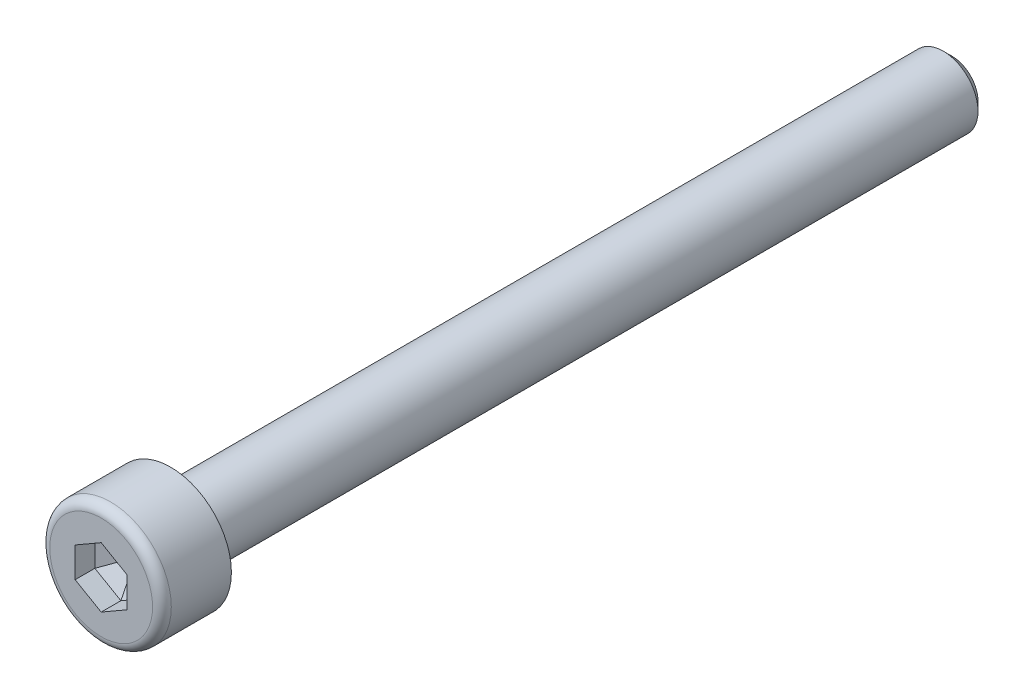
ISO-10303-21;
HEADER;
FILE_DESCRIPTION(('STEP AP214'),'2;1');
FILE_NAME('part.step','',(''),(''),'','','');
FILE_SCHEMA(('AUTOMOTIVE_DESIGN { 1 0 10303 214 1 1 1 1 }'));
ENDSEC;
DATA;
#1=APPLICATION_CONTEXT('core data for automotive mechanical design processes');
#2=APPLICATION_PROTOCOL_DEFINITION('international standard','automotive_design',2000,#1);
#3=PRODUCT_CONTEXT('',#1,'mechanical');
#4=PRODUCT('Part','Part','',(#3));
#5=PRODUCT_RELATED_PRODUCT_CATEGORY('part','',(#4));
#6=PRODUCT_DEFINITION_FORMATION('','',#4);
#7=PRODUCT_DEFINITION_CONTEXT('part definition',#1,'design');
#8=PRODUCT_DEFINITION('design','',#6,#7);
#9=PRODUCT_DEFINITION_SHAPE('','',#8);
#10=(LENGTH_UNIT() NAMED_UNIT(*) SI_UNIT(.MILLI.,.METRE.));
#11=(NAMED_UNIT(*) PLANE_ANGLE_UNIT() SI_UNIT($,.RADIAN.));
#12=(NAMED_UNIT(*) SI_UNIT($,.STERADIAN.) SOLID_ANGLE_UNIT());
#13=UNCERTAINTY_MEASURE_WITH_UNIT(LENGTH_MEASURE(1.E-05),#10,'distance_accuracy_value','');
#14=(GEOMETRIC_REPRESENTATION_CONTEXT(3) GLOBAL_UNCERTAINTY_ASSIGNED_CONTEXT((#13)) GLOBAL_UNIT_ASSIGNED_CONTEXT((#10,
#11,#12)) REPRESENTATION_CONTEXT('',''));
#15=CARTESIAN_POINT('',(0.,0.,0.));
#16=DIRECTION('',(0.,0.,1.));
#17=DIRECTION('',(1.,0.,0.));
#18=AXIS2_PLACEMENT_3D('',#15,#16,#17);
#19=CARTESIAN_POINT('',(0.,0.,0.));
#20=DIRECTION('',(0.,0.,1.));
#21=DIRECTION('',(1.,0.,0.));
#22=AXIS2_PLACEMENT_3D('',#19,#20,#21);
#23=PLANE('',#22);
#24=CARTESIAN_POINT('',(0.,0.,0.));
#25=DIRECTION('',(0.,0.,1.));
#26=DIRECTION('',(1.,0.,0.));
#27=AXIS2_PLACEMENT_3D('',#24,#25,#26);
#28=CIRCLE('',#27,2.1);
#29=CARTESIAN_POINT('',(2.1,0.,0.));
#30=VERTEX_POINT('',#29);
#31=EDGE_CURVE('E11',#30,#30,#28,.T.);
#32=ORIENTED_EDGE('',*,*,#31,.T.);
#33=EDGE_LOOP('',(#32));
#34=FACE_BOUND('',#33,.T.);
#35=CARTESIAN_POINT('',(0.,0.,0.));
#36=DIRECTION('',(0.,0.,1.));
#37=DIRECTION('',(1.,0.,0.));
#38=AXIS2_PLACEMENT_3D('',#35,#36,#37);
#39=CIRCLE('',#38,3.5);
#40=CARTESIAN_POINT('',(3.5,0.,0.));
#41=VERTEX_POINT('',#40);
#42=EDGE_CURVE('E154',#41,#41,#39,.T.);
#43=ORIENTED_EDGE('',*,*,#42,.F.);
#44=EDGE_LOOP('',(#43));
#45=FACE_BOUND('',#44,.T.);
#46=ADVANCED_FACE('F44',(#34,#45),#23,.F.);
#47=CARTESIAN_POINT('',(0.,0.,4.));
#48=DIRECTION('',(0.,0.,-1.));
#49=DIRECTION('',(-1.,0.,0.));
#50=AXIS2_PLACEMENT_3D('',#47,#48,#49);
#51=CYLINDRICAL_SURFACE('',#50,3.5);
#52=CARTESIAN_POINT('',(0.,0.,3.46153846153846));
#53=DIRECTION('',(0.,0.,1.));
#54=DIRECTION('',(1.,0.,0.));
#55=AXIS2_PLACEMENT_3D('',#52,#53,#54);
#56=CIRCLE('',#55,3.5);
#57=CARTESIAN_POINT('',(3.5,0.,3.46153846153846));
#58=VERTEX_POINT('',#57);
#59=EDGE_CURVE('E172',#58,#58,#56,.F.);
#60=ORIENTED_EDGE('',*,*,#59,.T.);
#61=EDGE_LOOP('',(#60));
#62=FACE_BOUND('',#61,.T.);
#63=ORIENTED_EDGE('',*,*,#42,.T.);
#64=EDGE_LOOP('',(#63));
#65=FACE_BOUND('',#64,.T.);
#66=ADVANCED_FACE('F231',(#62,#65),#51,.T.);
#67=CARTESIAN_POINT('',(0.,0.,4.));
#68=DIRECTION('',(0.,0.,1.));
#69=DIRECTION('',(1.,0.,0.));
#70=AXIS2_PLACEMENT_3D('',#67,#68,#69);
#71=PLANE('',#70);
#72=CARTESIAN_POINT('',(0.,0.,4.));
#73=DIRECTION('',(0.,0.,1.));
#74=DIRECTION('',(1.,0.,0.));
#75=AXIS2_PLACEMENT_3D('',#72,#73,#74);
#76=CIRCLE('',#75,2.96153846153846);
#77=CARTESIAN_POINT('',(2.96153846153846,0.,4.));
#78=VERTEX_POINT('',#77);
#79=EDGE_CURVE('E169',#78,#78,#76,.T.);
#80=ORIENTED_EDGE('',*,*,#79,.T.);
#81=EDGE_LOOP('',(#80));
#82=FACE_BOUND('',#81,.T.);
#83=DIRECTION('',(0.,1.,0.));
#84=VECTOR('',#83,1.);
#85=CARTESIAN_POINT('',(1.5,-0.866025403784439,4.));
#86=LINE('',#85,#84);
#87=CARTESIAN_POINT('',(1.5,-0.866025403784439,4.));
#88=VERTEX_POINT('',#87);
#89=CARTESIAN_POINT('',(1.5,0.866025403784439,4.));
#90=VERTEX_POINT('',#89);
#91=EDGE_CURVE('E136',#88,#90,#86,.T.);
#92=ORIENTED_EDGE('',*,*,#91,.F.);
#93=DIRECTION('',(0.866025403784439,0.5,0.));
#94=VECTOR('',#93,1.);
#95=CARTESIAN_POINT('',(0.,-1.73205080756888,4.));
#96=LINE('',#95,#94);
#97=CARTESIAN_POINT('',(0.,-1.73205080756888,4.));
#98=VERTEX_POINT('',#97);
#99=EDGE_CURVE('E149',#98,#88,#96,.T.);
#100=ORIENTED_EDGE('',*,*,#99,.F.);
#101=DIRECTION('',(0.866025403784439,-0.5,0.));
#102=VECTOR('',#101,1.);
#103=CARTESIAN_POINT('',(-1.5,-0.866025403784438,4.));
#104=LINE('',#103,#102);
#105=CARTESIAN_POINT('',(-1.5,-0.866025403784438,4.));
#106=VERTEX_POINT('',#105);
#107=EDGE_CURVE('E143',#106,#98,#104,.T.);
#108=ORIENTED_EDGE('',*,*,#107,.F.);
#109=DIRECTION('',(0.,-1.,0.));
#110=VECTOR('',#109,1.);
#111=CARTESIAN_POINT('',(-1.5,0.866025403784439,4.));
#112=LINE('',#111,#110);
#113=CARTESIAN_POINT('',(-1.5,0.866025403784439,4.));
#114=VERTEX_POINT('',#113);
#115=EDGE_CURVE('E141',#114,#106,#112,.T.);
#116=ORIENTED_EDGE('',*,*,#115,.F.);
#117=DIRECTION('',(-0.866025403784439,-0.5,0.));
#118=VECTOR('',#117,1.);
#119=CARTESIAN_POINT('',(0.,1.73205080756888,4.));
#120=LINE('',#119,#118);
#121=CARTESIAN_POINT('',(0.,1.73205080756888,4.));
#122=VERTEX_POINT('',#121);
#123=EDGE_CURVE('E121',#122,#114,#120,.T.);
#124=ORIENTED_EDGE('',*,*,#123,.F.);
#125=DIRECTION('',(-0.866025403784439,0.5,0.));
#126=VECTOR('',#125,1.);
#127=CARTESIAN_POINT('',(1.5,0.866025403784439,4.));
#128=LINE('',#127,#126);
#129=EDGE_CURVE('E131',#90,#122,#128,.T.);
#130=ORIENTED_EDGE('',*,*,#129,.F.);
#131=EDGE_LOOP('',(#92,#100,#108,#116,#124,#130));
#132=FACE_BOUND('',#131,.T.);
#133=ADVANCED_FACE('F138',(#82,#132),#71,.T.);
#134=CARTESIAN_POINT('',(1.5,-0.866025403784439,2.));
#135=DIRECTION('',(1.,0.,0.));
#136=DIRECTION('',(0.,1.,0.));
#137=AXIS2_PLACEMENT_3D('',#134,#135,#136);
#138=PLANE('',#137);
#139=DIRECTION('',(0.,0.,1.));
#140=VECTOR('',#139,1.);
#141=CARTESIAN_POINT('',(1.5,0.866025403784439,2.));
#142=LINE('',#141,#140);
#143=CARTESIAN_POINT('',(1.5,0.866025403784439,2.86455331412104));
#144=VERTEX_POINT('',#143);
#145=EDGE_CURVE('E128',#144,#90,#142,.T.);
#146=ORIENTED_EDGE('',*,*,#145,.F.);
#147=DIRECTION('',(0.,-1.,0.));
#148=VECTOR('',#147,1.);
#149=CARTESIAN_POINT('',(1.5,-0.866025403784439,2.86455331412104));
#150=LINE('',#149,#148);
#151=CARTESIAN_POINT('',(1.5,-0.866025403784439,2.86455331412104));
#152=VERTEX_POINT('',#151);
#153=EDGE_CURVE('E67',#144,#152,#150,.T.);
#154=ORIENTED_EDGE('',*,*,#153,.T.);
#155=DIRECTION('',(0.,0.,1.));
#156=VECTOR('',#155,1.);
#157=CARTESIAN_POINT('',(1.5,-0.866025403784439,2.));
#158=LINE('',#157,#156);
#159=EDGE_CURVE('E152',#152,#88,#158,.T.);
#160=ORIENTED_EDGE('',*,*,#159,.T.);
#161=ORIENTED_EDGE('',*,*,#91,.T.);
#162=EDGE_LOOP('',(#146,#154,#160,#161));
#163=FACE_BOUND('',#162,.T.);
#164=ADVANCED_FACE('F291',(#163),#138,.F.);
#165=CARTESIAN_POINT('',(0.,-1.73205080756888,2.));
#166=DIRECTION('',(0.5,-0.866025403784439,0.));
#167=DIRECTION('',(0.866025403784439,0.5,0.));
#168=AXIS2_PLACEMENT_3D('',#165,#166,#167);
#169=PLANE('',#168);
#170=ORIENTED_EDGE('',*,*,#159,.F.);
#171=DIRECTION('',(-0.866025403784439,-0.5,0.));
#172=VECTOR('',#171,1.);
#173=CARTESIAN_POINT('',(0.,-1.73205080756888,2.86455331412104));
#174=LINE('',#173,#172);
#175=CARTESIAN_POINT('',(0.,-1.73205080756888,2.86455331412104));
#176=VERTEX_POINT('',#175);
#177=EDGE_CURVE('E59',#152,#176,#174,.T.);
#178=ORIENTED_EDGE('',*,*,#177,.T.);
#179=DIRECTION('',(0.,0.,1.));
#180=VECTOR('',#179,1.);
#181=CARTESIAN_POINT('',(0.,-1.73205080756888,2.));
#182=LINE('',#181,#180);
#183=EDGE_CURVE('E155',#176,#98,#182,.T.);
#184=ORIENTED_EDGE('',*,*,#183,.T.);
#185=ORIENTED_EDGE('',*,*,#99,.T.);
#186=EDGE_LOOP('',(#170,#178,#184,#185));
#187=FACE_BOUND('',#186,.T.);
#188=ADVANCED_FACE('F293',(#187),#169,.F.);
#189=CARTESIAN_POINT('',(-1.5,-0.866025403784438,2.));
#190=DIRECTION('',(-0.5,-0.866025403784439,0.));
#191=DIRECTION('',(0.866025403784439,-0.5,0.));
#192=AXIS2_PLACEMENT_3D('',#189,#190,#191);
#193=PLANE('',#192);
#194=ORIENTED_EDGE('',*,*,#183,.F.);
#195=DIRECTION('',(-0.866025403784439,0.5,0.));
#196=VECTOR('',#195,1.);
#197=CARTESIAN_POINT('',(-1.5,-0.866025403784438,2.86455331412104));
#198=LINE('',#197,#196);
#199=CARTESIAN_POINT('',(-1.5,-0.866025403784438,2.86455331412104));
#200=VERTEX_POINT('',#199);
#201=EDGE_CURVE('E195',#176,#200,#198,.T.);
#202=ORIENTED_EDGE('',*,*,#201,.T.);
#203=DIRECTION('',(0.,0.,1.));
#204=VECTOR('',#203,1.);
#205=CARTESIAN_POINT('',(-1.5,-0.866025403784438,2.));
#206=LINE('',#205,#204);
#207=EDGE_CURVE('E157',#200,#106,#206,.T.);
#208=ORIENTED_EDGE('',*,*,#207,.T.);
#209=ORIENTED_EDGE('',*,*,#107,.T.);
#210=EDGE_LOOP('',(#194,#202,#208,#209));
#211=FACE_BOUND('',#210,.T.);
#212=ADVANCED_FACE('F282',(#211),#193,.F.);
#213=CARTESIAN_POINT('',(-1.5,0.866025403784439,2.));
#214=DIRECTION('',(-1.,0.,0.));
#215=DIRECTION('',(0.,0.,1.));
#216=AXIS2_PLACEMENT_3D('',#213,#214,#215);
#217=PLANE('',#216);
#218=ORIENTED_EDGE('',*,*,#207,.F.);
#219=DIRECTION('',(0.,1.,0.));
#220=VECTOR('',#219,1.);
#221=CARTESIAN_POINT('',(-1.5,0.866025403784439,2.86455331412104));
#222=LINE('',#221,#220);
#223=CARTESIAN_POINT('',(-1.5,0.866025403784439,2.86455331412104));
#224=VERTEX_POINT('',#223);
#225=EDGE_CURVE('E188',#200,#224,#222,.T.);
#226=ORIENTED_EDGE('',*,*,#225,.T.);
#227=DIRECTION('',(0.,0.,1.));
#228=VECTOR('',#227,1.);
#229=CARTESIAN_POINT('',(-1.5,0.866025403784439,2.));
#230=LINE('',#229,#228);
#231=EDGE_CURVE('E127',#224,#114,#230,.T.);
#232=ORIENTED_EDGE('',*,*,#231,.T.);
#233=ORIENTED_EDGE('',*,*,#115,.T.);
#234=EDGE_LOOP('',(#218,#226,#232,#233));
#235=FACE_BOUND('',#234,.T.);
#236=ADVANCED_FACE('F285',(#235),#217,.F.);
#237=CARTESIAN_POINT('',(0.,1.73205080756888,2.));
#238=DIRECTION('',(-0.5,0.866025403784439,0.));
#239=DIRECTION('',(-0.866025403784439,-0.5,0.));
#240=AXIS2_PLACEMENT_3D('',#237,#238,#239);
#241=PLANE('',#240);
#242=ORIENTED_EDGE('',*,*,#231,.F.);
#243=DIRECTION('',(0.866025403784439,0.5,0.));
#244=VECTOR('',#243,1.);
#245=CARTESIAN_POINT('',(0.,1.73205080756888,2.86455331412104));
#246=LINE('',#245,#244);
#247=CARTESIAN_POINT('',(0.,1.73205080756888,2.86455331412104));
#248=VERTEX_POINT('',#247);
#249=EDGE_CURVE('E124',#224,#248,#246,.T.);
#250=ORIENTED_EDGE('',*,*,#249,.T.);
#251=DIRECTION('',(0.,0.,1.));
#252=VECTOR('',#251,1.);
#253=CARTESIAN_POINT('',(0.,1.73205080756888,2.));
#254=LINE('',#253,#252);
#255=EDGE_CURVE('E116',#248,#122,#254,.T.);
#256=ORIENTED_EDGE('',*,*,#255,.T.);
#257=ORIENTED_EDGE('',*,*,#123,.T.);
#258=EDGE_LOOP('',(#242,#250,#256,#257));
#259=FACE_BOUND('',#258,.T.);
#260=ADVANCED_FACE('F119',(#259),#241,.F.);
#261=CARTESIAN_POINT('',(1.5,0.866025403784439,2.));
#262=DIRECTION('',(0.5,0.866025403784439,0.));
#263=DIRECTION('',(-0.866025403784439,0.5,0.));
#264=AXIS2_PLACEMENT_3D('',#261,#262,#263);
#265=PLANE('',#264);
#266=ORIENTED_EDGE('',*,*,#255,.F.);
#267=DIRECTION('',(0.866025403784439,-0.5,0.));
#268=VECTOR('',#267,1.);
#269=CARTESIAN_POINT('',(1.5,0.866025403784439,2.86455331412104));
#270=LINE('',#269,#268);
#271=EDGE_CURVE('E192',#248,#144,#270,.T.);
#272=ORIENTED_EDGE('',*,*,#271,.T.);
#273=ORIENTED_EDGE('',*,*,#145,.T.);
#274=ORIENTED_EDGE('',*,*,#129,.T.);
#275=EDGE_LOOP('',(#266,#272,#273,#274));
#276=FACE_BOUND('',#275,.T.);
#277=ADVANCED_FACE('F132',(#276),#265,.F.);
#278=CARTESIAN_POINT('',(0.,0.,2.));
#279=DIRECTION('',(0.,0.,1.));
#280=DIRECTION('',(1.,0.,0.));
#281=AXIS2_PLACEMENT_3D('',#278,#279,#280);
#282=PLANE('',#281);
#283=DIRECTION('',(-0.866025403784439,-0.5,0.));
#284=VECTOR('',#283,1.);
#285=CARTESIAN_POINT('',(-0.00127486704514114,0.00220813449507967,2.));
#286=LINE('',#285,#284);
#287=CARTESIAN_POINT('',(0.,0.00294417932677323,2.));
#288=VERTEX_POINT('',#287);
#289=CARTESIAN_POINT('',(-0.00254973409028264,0.00147208966338629,2.));
#290=VERTEX_POINT('',#289);
#291=EDGE_CURVE('E183',#288,#290,#286,.T.);
#292=ORIENTED_EDGE('',*,*,#291,.T.);
#293=DIRECTION('',(0.,-1.,0.));
#294=VECTOR('',#293,1.);
#295=CARTESIAN_POINT('',(-0.00254973409028261,0.,2.));
#296=LINE('',#295,#294);
#297=CARTESIAN_POINT('',(-0.00254973409028264,-0.00147208966338592,2.));
#298=VERTEX_POINT('',#297);
#299=EDGE_CURVE('E185',#290,#298,#296,.T.);
#300=ORIENTED_EDGE('',*,*,#299,.T.);
#301=DIRECTION('',(0.866025403784439,-0.5,0.));
#302=VECTOR('',#301,1.);
#303=CARTESIAN_POINT('',(-0.00127486704514098,-0.00220813449507938,2.));
#304=LINE('',#303,#302);
#305=CARTESIAN_POINT('',(0.,-0.00294417932677291,2.));
#306=VERTEX_POINT('',#305);
#307=EDGE_CURVE('E177',#298,#306,#304,.T.);
#308=ORIENTED_EDGE('',*,*,#307,.T.);
#309=DIRECTION('',(0.866025403784439,0.5,0.));
#310=VECTOR('',#309,1.);
#311=CARTESIAN_POINT('',(0.00127486704514128,-0.0022081344950799,2.));
#312=LINE('',#311,#310);
#313=CARTESIAN_POINT('',(0.00254973409028253,-0.00147208966338667,2.));
#314=VERTEX_POINT('',#313);
#315=EDGE_CURVE('E175',#306,#314,#312,.T.);
#316=ORIENTED_EDGE('',*,*,#315,.T.);
#317=DIRECTION('',(0.,1.,0.));
#318=VECTOR('',#317,1.);
#319=CARTESIAN_POINT('',(0.0025497340902825,0.,2.));
#320=LINE('',#319,#318);
#321=CARTESIAN_POINT('',(0.0025497340902825,0.00147208966338692,2.));
#322=VERTEX_POINT('',#321);
#323=EDGE_CURVE('E179',#314,#322,#320,.T.);
#324=ORIENTED_EDGE('',*,*,#323,.T.);
#325=DIRECTION('',(-0.866025403784439,0.5,0.));
#326=VECTOR('',#325,1.);
#327=CARTESIAN_POINT('',(0.00127486704514141,0.00220813449508014,2.));
#328=LINE('',#327,#326);
#329=EDGE_CURVE('E181',#322,#288,#328,.T.);
#330=ORIENTED_EDGE('',*,*,#329,.T.);
#331=EDGE_LOOP('',(#292,#300,#308,#316,#324,#330));
#332=FACE_BOUND('',#331,.T.);
#333=ADVANCED_FACE('F302',(#332),#282,.T.);
#334=CARTESIAN_POINT('',(0.,0.,-45.));
#335=DIRECTION('',(0.,0.,1.));
#336=DIRECTION('',(1.,0.,0.));
#337=AXIS2_PLACEMENT_3D('',#334,#335,#336);
#338=CYLINDRICAL_SURFACE('',#337,2.);
#339=CARTESIAN_POINT('',(0.,0.,-0.100000000000003));
#340=DIRECTION('',(0.,0.,1.));
#341=DIRECTION('',(1.,0.,0.));
#342=AXIS2_PLACEMENT_3D('',#339,#340,#341);
#343=CIRCLE('',#342,2.);
#344=CARTESIAN_POINT('',(2.,0.,-0.10000000000001));
#345=VERTEX_POINT('',#344);
#346=EDGE_CURVE('E52',#345,#345,#343,.F.);
#347=CARTESIAN_POINT('',(0.,0.,-44.5));
#348=DIRECTION('',(0.,0.,-1.));
#349=DIRECTION('',(-1.,0.,0.));
#350=AXIS2_PLACEMENT_3D('',#347,#348,#349);
#351=CIRCLE('',#350,2.);
#352=CARTESIAN_POINT('',(2.,0.,-44.5));
#353=VERTEX_POINT('',#352);
#354=EDGE_CURVE('E166',#353,#353,#351,.F.);
#355=CARTESIAN_POINT('',(2.,0.,-0.10000000000001));
#356=CARTESIAN_POINT('',(2.,0.,-0.56250000000001));
#357=CARTESIAN_POINT('',(2.,0.,-1.02500000000001));
#358=CARTESIAN_POINT('',(2.,0.,-1.95000000000001));
#359=CARTESIAN_POINT('',(2.,0.,-2.41250000000001));
#360=CARTESIAN_POINT('',(2.,0.,-3.33750000000001));
#361=CARTESIAN_POINT('',(2.,0.,-3.80000000000001));
#362=CARTESIAN_POINT('',(2.,0.,-4.72500000000001));
#363=CARTESIAN_POINT('',(2.,0.,-5.18750000000001));
#364=CARTESIAN_POINT('',(2.,0.,-6.11250000000001));
#365=CARTESIAN_POINT('',(2.,0.,-6.57500000000001));
#366=CARTESIAN_POINT('',(2.,0.,-7.50000000000001));
#367=CARTESIAN_POINT('',(2.,0.,-7.96250000000001));
#368=CARTESIAN_POINT('',(2.,0.,-8.88750000000001));
#369=CARTESIAN_POINT('',(2.,0.,-9.35000000000001));
#370=CARTESIAN_POINT('',(2.,0.,-10.275));
#371=CARTESIAN_POINT('',(2.,0.,-10.7375));
#372=CARTESIAN_POINT('',(2.,0.,-11.6625));
#373=CARTESIAN_POINT('',(2.,0.,-12.125));
#374=CARTESIAN_POINT('',(2.,0.,-13.05));
#375=CARTESIAN_POINT('',(2.,0.,-13.5125));
#376=CARTESIAN_POINT('',(2.,0.,-14.4375));
#377=CARTESIAN_POINT('',(2.,0.,-14.9));
#378=CARTESIAN_POINT('',(2.,0.,-15.825));
#379=CARTESIAN_POINT('',(2.,0.,-16.2875));
#380=CARTESIAN_POINT('',(2.,0.,-17.2125));
#381=CARTESIAN_POINT('',(2.,0.,-17.675));
#382=CARTESIAN_POINT('',(2.,0.,-18.6));
#383=CARTESIAN_POINT('',(2.,0.,-19.0625));
#384=CARTESIAN_POINT('',(2.,0.,-19.9875));
#385=CARTESIAN_POINT('',(2.,0.,-20.45));
#386=CARTESIAN_POINT('',(2.,0.,-21.375));
#387=CARTESIAN_POINT('',(2.,0.,-21.8375));
#388=CARTESIAN_POINT('',(2.,0.,-22.7625));
#389=CARTESIAN_POINT('',(2.,0.,-23.225));
#390=CARTESIAN_POINT('',(2.,0.,-24.15));
#391=CARTESIAN_POINT('',(2.,0.,-24.6125));
#392=CARTESIAN_POINT('',(2.,0.,-25.5375));
#393=CARTESIAN_POINT('',(2.,0.,-26.));
#394=CARTESIAN_POINT('',(2.,0.,-26.925));
#395=CARTESIAN_POINT('',(2.,0.,-27.3875));
#396=CARTESIAN_POINT('',(2.,0.,-28.3125));
#397=CARTESIAN_POINT('',(2.,0.,-28.775));
#398=CARTESIAN_POINT('',(2.,0.,-29.7));
#399=CARTESIAN_POINT('',(2.,0.,-30.1625));
#400=CARTESIAN_POINT('',(2.,0.,-31.0875));
#401=CARTESIAN_POINT('',(2.,0.,-31.55));
#402=CARTESIAN_POINT('',(2.,0.,-32.475));
#403=CARTESIAN_POINT('',(2.,0.,-32.9375));
#404=CARTESIAN_POINT('',(2.,0.,-33.8625));
#405=CARTESIAN_POINT('',(2.,0.,-34.325));
#406=CARTESIAN_POINT('',(2.,0.,-35.25));
#407=CARTESIAN_POINT('',(2.,0.,-35.7125));
#408=CARTESIAN_POINT('',(2.,0.,-36.6375));
#409=CARTESIAN_POINT('',(2.,0.,-37.1));
#410=CARTESIAN_POINT('',(2.,0.,-38.025));
#411=CARTESIAN_POINT('',(2.,0.,-38.4875));
#412=CARTESIAN_POINT('',(2.,0.,-39.4125));
#413=CARTESIAN_POINT('',(2.,0.,-39.875));
#414=CARTESIAN_POINT('',(2.,0.,-40.8));
#415=CARTESIAN_POINT('',(2.,0.,-41.2625));
#416=CARTESIAN_POINT('',(2.,0.,-42.1875));
#417=CARTESIAN_POINT('',(2.,0.,-42.65));
#418=CARTESIAN_POINT('',(2.,0.,-43.575));
#419=CARTESIAN_POINT('',(2.,0.,-44.0375));
#420=CARTESIAN_POINT('',(2.,0.,-44.5));
#421=B_SPLINE_CURVE_WITH_KNOTS('',3,(#355,#356,#357,#358,#359,#360,#361,#362,#363,#364,#365,
#366,#367,#368,#369,#370,#371,#372,#373,#374,#375,#376,#377,#378,#379,#380,#381,#382,#383,#384,
#385,#386,#387,#388,#389,#390,#391,#392,#393,#394,#395,#396,#397,#398,#399,#400,#401,#402,#403,
#404,#405,#406,#407,#408,#409,#410,#411,#412,#413,#414,#415,#416,#417,#418,#419,#420),
.UNSPECIFIED.,.F.,.F.,(4,2,2,2,2,2,2,2,2,2,2,2,2,2,2,2,2,2,2,2,2,2,2,2,2,2,2,2,2,2,2,2,4),(0.,
1.3875,2.775,4.1625,5.55,6.9375,8.325,9.71250000000001,11.1,12.4875,13.875,15.2625,16.65,
18.0375,19.425,20.8125,22.2,23.5875,24.975,26.3625,27.75,29.1375,30.525,31.9125,33.3,34.6875,
36.075,37.4625,38.85,40.2375,41.625,43.0125,44.4),.UNSPECIFIED.);
#422=EDGE_CURVE('BSEAM216',#345,#353,#421,.T.);
#423=ORIENTED_EDGE('',*,*,#346,.T.);
#424=ORIENTED_EDGE('',*,*,#354,.T.);
#425=ORIENTED_EDGE('',*,*,#422,.T.);
#426=ORIENTED_EDGE('',*,*,#422,.F.);
#427=EDGE_LOOP('',(#423,#425,#424,#426));
#428=FACE_BOUND('',#427,.T.);
#429=ADVANCED_FACE('F216',(#428),#338,.T.);
#430=CARTESIAN_POINT('',(0.,0.,-45.));
#431=DIRECTION('',(0.,0.,-1.));
#432=DIRECTION('',(-1.,0.,0.));
#433=AXIS2_PLACEMENT_3D('',#430,#431,#432);
#434=PLANE('',#433);
#435=CARTESIAN_POINT('',(0.,0.,-45.));
#436=DIRECTION('',(0.,0.,-1.));
#437=DIRECTION('',(-1.,0.,0.));
#438=AXIS2_PLACEMENT_3D('',#435,#436,#437);
#439=CIRCLE('',#438,1.50000000000003);
#440=CARTESIAN_POINT('',(-1.50000000000003,0.,-45.));
#441=VERTEX_POINT('',#440);
#442=EDGE_CURVE('E163',#441,#441,#439,.T.);
#443=ORIENTED_EDGE('',*,*,#442,.T.);
#444=EDGE_LOOP('',(#443));
#445=FACE_BOUND('',#444,.T.);
#446=ADVANCED_FACE('F247',(#445),#434,.T.);
#447=CARTESIAN_POINT('',(0.,0.,-45.));
#448=DIRECTION('',(0.,0.,1.));
#449=DIRECTION('',(1.,0.,0.));
#450=AXIS2_PLACEMENT_3D('',#447,#448,#449);
#451=CONICAL_SURFACE('',#450,1.50000000000003,0.785398163397447);
#452=ORIENTED_EDGE('',*,*,#354,.F.);
#453=EDGE_LOOP('',(#452));
#454=FACE_BOUND('',#453,.T.);
#455=ORIENTED_EDGE('',*,*,#442,.F.);
#456=EDGE_LOOP('',(#455));
#457=FACE_BOUND('',#456,.T.);
#458=ADVANCED_FACE('F243',(#454,#457),#451,.T.);
#459=CARTESIAN_POINT('',(0.,0.,3.46153846153846));
#460=DIRECTION('',(0.,0.,1.));
#461=DIRECTION('',(1.,0.,0.));
#462=AXIS2_PLACEMENT_3D('',#459,#460,#461);
#463=TOROIDAL_SURFACE('',#462,2.96153846153846,0.538461538461538);
#464=ORIENTED_EDGE('',*,*,#59,.F.);
#465=EDGE_LOOP('',(#464));
#466=FACE_BOUND('',#465,.T.);
#467=ORIENTED_EDGE('',*,*,#79,.F.);
#468=EDGE_LOOP('',(#467));
#469=FACE_BOUND('',#468,.T.);
#470=ADVANCED_FACE('F246',(#466,#469),#463,.T.);
#471=CARTESIAN_POINT('',(0.0025497340902825,0.,2.));
#472=DIRECTION('',(0.499999999999994,0.,-0.866025403784442));
#473=DIRECTION('',(0.,1.,0.));
#474=AXIS2_PLACEMENT_3D('',#471,#472,#473);
#475=PLANE('',#474);
#476=DIRECTION('',(-0.774596669241486,0.447213595499959,-0.447213595499952));
#477=VECTOR('',#476,1.);
#478=CARTESIAN_POINT('',(0.00203978727222598,-0.0011776717307093,1.99970558206732));
#479=LINE('',#478,#477);
#480=EDGE_CURVE('E208',#152,#314,#479,.T.);
#481=ORIENTED_EDGE('',*,*,#480,.F.);
#482=ORIENTED_EDGE('',*,*,#153,.F.);
#483=DIRECTION('',(-0.774596669241486,-0.447213595499959,-0.447213595499952));
#484=VECTOR('',#483,1.);
#485=CARTESIAN_POINT('',(0.00203978727222607,0.00117767173070967,1.99970558206732));
#486=LINE('',#485,#484);
#487=EDGE_CURVE('E211',#322,#144,#486,.F.);
#488=ORIENTED_EDGE('',*,*,#487,.F.);
#489=ORIENTED_EDGE('',*,*,#323,.F.);
#490=EDGE_LOOP('',(#481,#482,#488,#489));
#491=FACE_BOUND('',#490,.T.);
#492=ADVANCED_FACE('F250',(#491),#475,.F.);
#493=CARTESIAN_POINT('',(0.00127486704514141,0.00220813449508014,2.));
#494=DIRECTION('',(0.249999999999997,0.433012701892214,-0.866025403784442));
#495=DIRECTION('',(-0.866025403784439,0.5,0.));
#496=AXIS2_PLACEMENT_3D('',#493,#494,#495);
#497=PLANE('',#496);
#498=ORIENTED_EDGE('',*,*,#487,.T.);
#499=ORIENTED_EDGE('',*,*,#271,.F.);
#500=DIRECTION('',(0.,-0.894427190999919,-0.447213595499952));
#501=VECTOR('',#500,1.);
#502=CARTESIAN_POINT('',(0.,0.00235534346141828,1.99970558206732));
#503=LINE('',#502,#501);
#504=EDGE_CURVE('E205',#288,#248,#503,.F.);
#505=ORIENTED_EDGE('',*,*,#504,.F.);
#506=ORIENTED_EDGE('',*,*,#329,.F.);
#507=EDGE_LOOP('',(#498,#499,#505,#506));
#508=FACE_BOUND('',#507,.T.);
#509=ADVANCED_FACE('F263',(#508),#497,.F.);
#510=CARTESIAN_POINT('',(0.00127486704514128,-0.0022081344950799,2.));
#511=DIRECTION('',(0.249999999999997,-0.433012701892214,-0.866025403784442));
#512=DIRECTION('',(0.866025403784439,0.5,0.));
#513=AXIS2_PLACEMENT_3D('',#510,#511,#512);
#514=PLANE('',#513);
#515=ORIENTED_EDGE('',*,*,#480,.T.);
#516=ORIENTED_EDGE('',*,*,#315,.F.);
#517=DIRECTION('',(0.,-0.894427190999919,0.447213595499952));
#518=VECTOR('',#517,1.);
#519=CARTESIAN_POINT('',(0.,-0.00235534346141803,1.99970558206732));
#520=LINE('',#519,#518);
#521=EDGE_CURVE('E202',#176,#306,#520,.F.);
#522=ORIENTED_EDGE('',*,*,#521,.F.);
#523=ORIENTED_EDGE('',*,*,#177,.F.);
#524=EDGE_LOOP('',(#515,#516,#522,#523));
#525=FACE_BOUND('',#524,.T.);
#526=ADVANCED_FACE('F259',(#525),#514,.F.);
#527=CARTESIAN_POINT('',(-0.00127486704514109,0.00220813449507957,2.));
#528=DIRECTION('',(-0.249999999999997,0.433012701892214,-0.866025403784442));
#529=DIRECTION('',(-0.866025403784439,-0.5,0.));
#530=AXIS2_PLACEMENT_3D('',#527,#528,#529);
#531=PLANE('',#530);
#532=ORIENTED_EDGE('',*,*,#504,.T.);
#533=ORIENTED_EDGE('',*,*,#249,.F.);
#534=DIRECTION('',(0.774596669241486,-0.44721359549996,-0.447213595499952));
#535=VECTOR('',#534,1.);
#536=CARTESIAN_POINT('',(-0.00203978727222626,0.0011776717307089,1.99970558206732));
#537=LINE('',#536,#535);
#538=EDGE_CURVE('E200',#290,#224,#537,.F.);
#539=ORIENTED_EDGE('',*,*,#538,.F.);
#540=ORIENTED_EDGE('',*,*,#291,.F.);
#541=EDGE_LOOP('',(#532,#533,#539,#540));
#542=FACE_BOUND('',#541,.T.);
#543=ADVANCED_FACE('F255',(#542),#531,.F.);
#544=CARTESIAN_POINT('',(-0.00127486704514095,-0.00220813449507934,2.));
#545=DIRECTION('',(-0.249999999999997,-0.433012701892214,-0.866025403784442));
#546=DIRECTION('',(0.866025403784439,-0.5,0.));
#547=AXIS2_PLACEMENT_3D('',#544,#545,#546);
#548=PLANE('',#547);
#549=ORIENTED_EDGE('',*,*,#521,.T.);
#550=ORIENTED_EDGE('',*,*,#307,.F.);
#551=DIRECTION('',(-0.774596669241486,-0.44721359549996,0.447213595499952));
#552=VECTOR('',#551,1.);
#553=CARTESIAN_POINT('',(-0.00203978727222637,-0.00117767173070865,1.99970558206732));
#554=LINE('',#553,#552);
#555=EDGE_CURVE('E198',#200,#298,#554,.F.);
#556=ORIENTED_EDGE('',*,*,#555,.F.);
#557=ORIENTED_EDGE('',*,*,#201,.F.);
#558=EDGE_LOOP('',(#549,#550,#556,#557));
#559=FACE_BOUND('',#558,.T.);
#560=ADVANCED_FACE('F226',(#559),#548,.F.);
#561=CARTESIAN_POINT('',(-0.00254973409028261,0.,2.));
#562=DIRECTION('',(-0.499999999999994,0.,-0.866025403784442));
#563=DIRECTION('',(0.,-1.,0.));
#564=AXIS2_PLACEMENT_3D('',#561,#562,#563);
#565=PLANE('',#564);
#566=ORIENTED_EDGE('',*,*,#538,.T.);
#567=ORIENTED_EDGE('',*,*,#225,.F.);
#568=ORIENTED_EDGE('',*,*,#555,.T.);
#569=ORIENTED_EDGE('',*,*,#299,.F.);
#570=EDGE_LOOP('',(#566,#567,#568,#569));
#571=FACE_BOUND('',#570,.T.);
#572=ADVANCED_FACE('F220',(#571),#565,.F.);
#573=CARTESIAN_POINT('',(0.,0.,-0.100000000000003));
#574=DIRECTION('',(0.,0.,1.));
#575=DIRECTION('',(1.,0.,0.));
#576=AXIS2_PLACEMENT_3D('',#573,#574,#575);
#577=TOROIDAL_SURFACE('',#576,2.1,0.1);
#578=ORIENTED_EDGE('',*,*,#31,.F.);
#579=EDGE_LOOP('',(#578));
#580=FACE_BOUND('',#579,.T.);
#581=ORIENTED_EDGE('',*,*,#346,.F.);
#582=EDGE_LOOP('',(#581));
#583=FACE_BOUND('',#582,.T.);
#584=ADVANCED_FACE('F46',(#580,#583),#577,.F.);
#585=CLOSED_SHELL('',(#46,#66,#133,#164,#188,#212,#236,#260,#277,#333,#429,#446,#458,#470,#492,
#509,#526,#543,#560,#572,#584));
#586=MANIFOLD_SOLID_BREP('B2',#585);
#587=ADVANCED_BREP_SHAPE_REPRESENTATION('',(#18,#586),#14);
#588=SHAPE_DEFINITION_REPRESENTATION(#9,#587);
ENDSEC;
END-ISO-10303-21;
